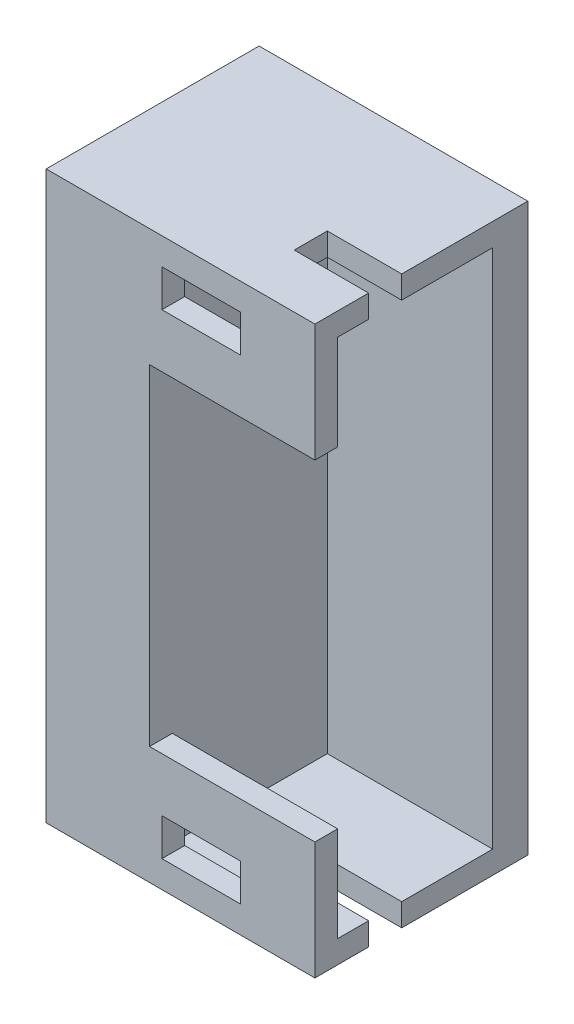
ISO-10303-21;
HEADER;
FILE_DESCRIPTION(('STEP AP214'),'2;1');
FILE_NAME('part.step','',(''),(''),'','','');
FILE_SCHEMA(('AUTOMOTIVE_DESIGN { 1 0 10303 214 1 1 1 1 }'));
ENDSEC;
DATA;
#1=APPLICATION_CONTEXT('core data for automotive mechanical design processes');
#2=APPLICATION_PROTOCOL_DEFINITION('international standard','automotive_design',2000,#1);
#3=PRODUCT_CONTEXT('',#1,'mechanical');
#4=PRODUCT('Part','Part','',(#3));
#5=PRODUCT_RELATED_PRODUCT_CATEGORY('part','',(#4));
#6=PRODUCT_DEFINITION_FORMATION('','',#4);
#7=PRODUCT_DEFINITION_CONTEXT('part definition',#1,'design');
#8=PRODUCT_DEFINITION('design','',#6,#7);
#9=PRODUCT_DEFINITION_SHAPE('','',#8);
#10=(LENGTH_UNIT() NAMED_UNIT(*) SI_UNIT(.MILLI.,.METRE.));
#11=(NAMED_UNIT(*) PLANE_ANGLE_UNIT() SI_UNIT($,.RADIAN.));
#12=(NAMED_UNIT(*) SI_UNIT($,.STERADIAN.) SOLID_ANGLE_UNIT());
#13=UNCERTAINTY_MEASURE_WITH_UNIT(LENGTH_MEASURE(1.E-05),#10,'distance_accuracy_value','');
#14=(GEOMETRIC_REPRESENTATION_CONTEXT(3) GLOBAL_UNCERTAINTY_ASSIGNED_CONTEXT((#13)) GLOBAL_UNIT_ASSIGNED_CONTEXT((#10,
#11,#12)) REPRESENTATION_CONTEXT('',''));
#15=CARTESIAN_POINT('',(0.,0.,0.));
#16=DIRECTION('',(0.,0.,1.));
#17=DIRECTION('',(1.,0.,0.));
#18=AXIS2_PLACEMENT_3D('',#15,#16,#17);
#19=CARTESIAN_POINT('',(26.,-4.,-31.));
#20=DIRECTION('',(0.,0.,1.));
#21=DIRECTION('',(1.,0.,0.));
#22=AXIS2_PLACEMENT_3D('',#19,#20,#21);
#23=PLANE('',#22);
#24=DIRECTION('',(1.,0.,0.));
#25=VECTOR('',#24,1.);
#26=CARTESIAN_POINT('',(24.2,-6.2,-31.));
#27=LINE('',#26,#25);
#28=CARTESIAN_POINT('',(24.2,-6.2,-31.));
#29=VERTEX_POINT('',#28);
#30=CARTESIAN_POINT('',(22.3,-6.2,-31.));
#31=VERTEX_POINT('',#30);
#32=EDGE_CURVE('E351',#29,#31,#27,.F.);
#33=ORIENTED_EDGE('',*,*,#32,.F.);
#34=DIRECTION('',(0.,1.,0.));
#35=VECTOR('',#34,1.);
#36=CARTESIAN_POINT('',(24.2,-5.3,-31.));
#37=LINE('',#36,#35);
#38=CARTESIAN_POINT('',(24.2,-5.3,-31.));
#39=VERTEX_POINT('',#38);
#40=EDGE_CURVE('E356',#39,#29,#37,.F.);
#41=ORIENTED_EDGE('',*,*,#40,.F.);
#42=DIRECTION('',(1.,0.,0.));
#43=VECTOR('',#42,1.);
#44=CARTESIAN_POINT('',(22.3,-5.3,-31.));
#45=LINE('',#44,#43);
#46=CARTESIAN_POINT('',(22.3,-5.3,-31.));
#47=VERTEX_POINT('',#46);
#48=EDGE_CURVE('E361',#47,#39,#45,.T.);
#49=ORIENTED_EDGE('',*,*,#48,.F.);
#50=DIRECTION('',(0.,1.,0.));
#51=VECTOR('',#50,1.);
#52=CARTESIAN_POINT('',(22.3,-6.2,-31.));
#53=LINE('',#52,#51);
#54=EDGE_CURVE('E250',#31,#47,#53,.T.);
#55=ORIENTED_EDGE('',*,*,#54,.F.);
#56=EDGE_LOOP('',(#33,#41,#49,#55));
#57=FACE_BOUND('',#56,.T.);
#58=DIRECTION('',(0.,1.,0.));
#59=VECTOR('',#58,1.);
#60=CARTESIAN_POINT('',(26.,-6.85,-31.));
#61=LINE('',#60,#59);
#62=CARTESIAN_POINT('',(26.,-4.,-31.));
#63=VERTEX_POINT('',#62);
#64=CARTESIAN_POINT('',(26.,-6.3,-31.));
#65=VERTEX_POINT('',#64);
#66=EDGE_CURVE('E206',#63,#65,#61,.F.);
#67=ORIENTED_EDGE('',*,*,#66,.T.);
#68=DIRECTION('',(1.,0.,0.));
#69=VECTOR('',#68,1.);
#70=CARTESIAN_POINT('',(26.,-6.3,-31.));
#71=LINE('',#70,#69);
#72=CARTESIAN_POINT('',(22.,-6.3,-31.));
#73=VERTEX_POINT('',#72);
#74=EDGE_CURVE('E319',#65,#73,#71,.F.);
#75=ORIENTED_EDGE('',*,*,#74,.T.);
#76=DIRECTION('',(0.,1.,0.));
#77=VECTOR('',#76,1.);
#78=CARTESIAN_POINT('',(22.,0.,-31.));
#79=LINE('',#78,#77);
#80=CARTESIAN_POINT('',(22.,-4.,-31.));
#81=VERTEX_POINT('',#80);
#82=EDGE_CURVE('E222',#81,#73,#79,.F.);
#83=ORIENTED_EDGE('',*,*,#82,.F.);
#84=DIRECTION('',(1.,0.,0.));
#85=VECTOR('',#84,1.);
#86=CARTESIAN_POINT('',(26.,-4.,-31.));
#87=LINE('',#86,#85);
#88=EDGE_CURVE('E199',#81,#63,#87,.T.);
#89=ORIENTED_EDGE('',*,*,#88,.T.);
#90=EDGE_LOOP('',(#67,#75,#83,#89));
#91=FACE_BOUND('',#90,.T.);
#92=ADVANCED_FACE('F16',(#57,#91),#23,.F.);
#93=CARTESIAN_POINT('',(26.,6.3,-31.));
#94=DIRECTION('',(0.,0.,1.));
#95=DIRECTION('',(1.,0.,0.));
#96=AXIS2_PLACEMENT_3D('',#93,#94,#95);
#97=PLANE('',#96);
#98=DIRECTION('',(1.,0.,0.));
#99=VECTOR('',#98,1.);
#100=CARTESIAN_POINT('',(24.2,5.3,-31.));
#101=LINE('',#100,#99);
#102=CARTESIAN_POINT('',(24.2,5.3,-31.));
#103=VERTEX_POINT('',#102);
#104=CARTESIAN_POINT('',(22.3,5.3,-31.));
#105=VERTEX_POINT('',#104);
#106=EDGE_CURVE('E332',#103,#105,#101,.F.);
#107=ORIENTED_EDGE('',*,*,#106,.F.);
#108=DIRECTION('',(0.,1.,0.));
#109=VECTOR('',#108,1.);
#110=CARTESIAN_POINT('',(24.2,6.2,-31.));
#111=LINE('',#110,#109);
#112=CARTESIAN_POINT('',(24.2,6.2,-31.));
#113=VERTEX_POINT('',#112);
#114=EDGE_CURVE('E337',#113,#103,#111,.F.);
#115=ORIENTED_EDGE('',*,*,#114,.F.);
#116=DIRECTION('',(1.,0.,0.));
#117=VECTOR('',#116,1.);
#118=CARTESIAN_POINT('',(22.3,6.2,-31.));
#119=LINE('',#118,#117);
#120=CARTESIAN_POINT('',(22.3,6.2,-31.));
#121=VERTEX_POINT('',#120);
#122=EDGE_CURVE('E342',#121,#113,#119,.T.);
#123=ORIENTED_EDGE('',*,*,#122,.F.);
#124=DIRECTION('',(0.,1.,0.));
#125=VECTOR('',#124,1.);
#126=CARTESIAN_POINT('',(22.3,5.3,-31.));
#127=LINE('',#126,#125);
#128=EDGE_CURVE('E347',#105,#121,#127,.T.);
#129=ORIENTED_EDGE('',*,*,#128,.F.);
#130=EDGE_LOOP('',(#107,#115,#123,#129));
#131=FACE_BOUND('',#130,.T.);
#132=DIRECTION('',(0.,1.,0.));
#133=VECTOR('',#132,1.);
#134=CARTESIAN_POINT('',(26.,-6.85,-31.));
#135=LINE('',#134,#133);
#136=CARTESIAN_POINT('',(26.,6.3,-31.));
#137=VERTEX_POINT('',#136);
#138=CARTESIAN_POINT('',(26.,4.,-31.));
#139=VERTEX_POINT('',#138);
#140=EDGE_CURVE('E19',#137,#139,#135,.F.);
#141=ORIENTED_EDGE('',*,*,#140,.T.);
#142=DIRECTION('',(1.,0.,0.));
#143=VECTOR('',#142,1.);
#144=CARTESIAN_POINT('',(26.,4.,-31.));
#145=LINE('',#144,#143);
#146=CARTESIAN_POINT('',(22.,4.,-31.));
#147=VERTEX_POINT('',#146);
#148=EDGE_CURVE('E235',#139,#147,#145,.F.);
#149=ORIENTED_EDGE('',*,*,#148,.T.);
#150=DIRECTION('',(0.,1.,0.));
#151=VECTOR('',#150,1.);
#152=CARTESIAN_POINT('',(22.,0.,-31.));
#153=LINE('',#152,#151);
#154=CARTESIAN_POINT('',(22.,6.3,-31.));
#155=VERTEX_POINT('',#154);
#156=EDGE_CURVE('E257',#155,#147,#153,.F.);
#157=ORIENTED_EDGE('',*,*,#156,.F.);
#158=DIRECTION('',(1.,0.,0.));
#159=VECTOR('',#158,1.);
#160=CARTESIAN_POINT('',(26.,6.3,-31.));
#161=LINE('',#160,#159);
#162=EDGE_CURVE('E237',#155,#137,#161,.T.);
#163=ORIENTED_EDGE('',*,*,#162,.T.);
#164=EDGE_LOOP('',(#141,#149,#157,#163));
#165=FACE_BOUND('',#164,.T.);
#166=ADVANCED_FACE('F234',(#131,#165),#97,.F.);
#167=CARTESIAN_POINT('',(26.,-6.85,-35.05));
#168=DIRECTION('',(-1.,0.,0.));
#169=DIRECTION('',(0.,0.,1.));
#170=AXIS2_PLACEMENT_3D('',#167,#168,#169);
#171=PLANE('',#170);
#172=DIRECTION('',(0.,1.,0.));
#173=VECTOR('',#172,1.);
#174=CARTESIAN_POINT('',(26.,0.,-30.45));
#175=LINE('',#174,#173);
#176=CARTESIAN_POINT('',(26.,4.,-30.45));
#177=VERTEX_POINT('',#176);
#178=CARTESIAN_POINT('',(26.,6.85,-30.45));
#179=VERTEX_POINT('',#178);
#180=EDGE_CURVE('E255',#177,#179,#175,.T.);
#181=ORIENTED_EDGE('',*,*,#180,.F.);
#182=DIRECTION('',(0.,0.,1.));
#183=VECTOR('',#182,1.);
#184=CARTESIAN_POINT('',(26.,4.,-31.));
#185=LINE('',#184,#183);
#186=EDGE_CURVE('E246',#177,#139,#185,.F.);
#187=ORIENTED_EDGE('',*,*,#186,.T.);
#188=ORIENTED_EDGE('',*,*,#140,.F.);
#189=DIRECTION('',(0.,0.,1.));
#190=VECTOR('',#189,1.);
#191=CARTESIAN_POINT('',(26.,6.3,-34.5));
#192=LINE('',#191,#190);
#193=CARTESIAN_POINT('',(26.,6.3,-31.75));
#194=VERTEX_POINT('',#193);
#195=EDGE_CURVE('E293',#137,#194,#192,.F.);
#196=ORIENTED_EDGE('',*,*,#195,.T.);
#197=DIRECTION('',(0.,1.,0.));
#198=VECTOR('',#197,1.);
#199=CARTESIAN_POINT('',(26.,-6.85,-31.75));
#200=LINE('',#199,#198);
#201=CARTESIAN_POINT('',(26.,6.85,-31.75));
#202=VERTEX_POINT('',#201);
#203=EDGE_CURVE('E283',#202,#194,#200,.F.);
#204=ORIENTED_EDGE('',*,*,#203,.F.);
#205=DIRECTION('',(0.,0.,1.));
#206=VECTOR('',#205,1.);
#207=CARTESIAN_POINT('',(26.,6.85,-35.05));
#208=LINE('',#207,#206);
#209=EDGE_CURVE('E226',#179,#202,#208,.F.);
#210=ORIENTED_EDGE('',*,*,#209,.F.);
#211=EDGE_LOOP('',(#181,#187,#188,#196,#204,#210));
#212=FACE_BOUND('',#211,.T.);
#213=ADVANCED_FACE('F253',(#212),#171,.F.);
#214=CARTESIAN_POINT('',(26.,-6.85,-35.05));
#215=DIRECTION('',(-1.,0.,0.));
#216=DIRECTION('',(0.,0.,1.));
#217=AXIS2_PLACEMENT_3D('',#214,#215,#216);
#218=PLANE('',#217);
#219=DIRECTION('',(0.,0.,-1.));
#220=VECTOR('',#219,1.);
#221=CARTESIAN_POINT('',(26.,-6.3,-31.));
#222=LINE('',#221,#220);
#223=CARTESIAN_POINT('',(26.,-6.3,-31.75));
#224=VERTEX_POINT('',#223);
#225=EDGE_CURVE('E212',#224,#65,#222,.F.);
#226=ORIENTED_EDGE('',*,*,#225,.T.);
#227=ORIENTED_EDGE('',*,*,#66,.F.);
#228=DIRECTION('',(0.,0.,-1.));
#229=VECTOR('',#228,1.);
#230=CARTESIAN_POINT('',(26.,-4.,-30.45));
#231=LINE('',#230,#229);
#232=CARTESIAN_POINT('',(26.,-4.,-30.45));
#233=VERTEX_POINT('',#232);
#234=EDGE_CURVE('E209',#63,#233,#231,.F.);
#235=ORIENTED_EDGE('',*,*,#234,.T.);
#236=DIRECTION('',(0.,1.,0.));
#237=VECTOR('',#236,1.);
#238=CARTESIAN_POINT('',(26.,0.,-30.45));
#239=LINE('',#238,#237);
#240=CARTESIAN_POINT('',(26.,-6.85,-30.45));
#241=VERTEX_POINT('',#240);
#242=EDGE_CURVE('E273',#241,#233,#239,.T.);
#243=ORIENTED_EDGE('',*,*,#242,.F.);
#244=DIRECTION('',(0.,0.,1.));
#245=VECTOR('',#244,1.);
#246=CARTESIAN_POINT('',(26.,-6.85,-35.05));
#247=LINE('',#246,#245);
#248=CARTESIAN_POINT('',(26.,-6.85,-31.75));
#249=VERTEX_POINT('',#248);
#250=EDGE_CURVE('E215',#249,#241,#247,.T.);
#251=ORIENTED_EDGE('',*,*,#250,.F.);
#252=DIRECTION('',(0.,1.,0.));
#253=VECTOR('',#252,1.);
#254=CARTESIAN_POINT('',(26.,-6.85,-31.75));
#255=LINE('',#254,#253);
#256=EDGE_CURVE('E327',#224,#249,#255,.F.);
#257=ORIENTED_EDGE('',*,*,#256,.F.);
#258=EDGE_LOOP('',(#226,#227,#235,#243,#251,#257));
#259=FACE_BOUND('',#258,.T.);
#260=ADVANCED_FACE('F207',(#259),#218,.F.);
#261=CARTESIAN_POINT('',(26.,-4.,-30.45));
#262=DIRECTION('',(0.,-1.,0.));
#263=DIRECTION('',(0.,0.,-1.));
#264=AXIS2_PLACEMENT_3D('',#261,#262,#263);
#265=PLANE('',#264);
#266=ORIENTED_EDGE('',*,*,#234,.F.);
#267=ORIENTED_EDGE('',*,*,#88,.F.);
#268=DIRECTION('',(0.,0.,-1.));
#269=VECTOR('',#268,1.);
#270=CARTESIAN_POINT('',(22.,-4.,-32.55097597597));
#271=LINE('',#270,#269);
#272=CARTESIAN_POINT('',(22.,-4.,-30.45));
#273=VERTEX_POINT('',#272);
#274=EDGE_CURVE('E219',#273,#81,#271,.T.);
#275=ORIENTED_EDGE('',*,*,#274,.F.);
#276=DIRECTION('',(1.,0.,0.));
#277=VECTOR('',#276,1.);
#278=CARTESIAN_POINT('',(23.25,-4.,-30.45));
#279=LINE('',#278,#277);
#280=EDGE_CURVE('E218',#233,#273,#279,.F.);
#281=ORIENTED_EDGE('',*,*,#280,.F.);
#282=EDGE_LOOP('',(#266,#267,#275,#281));
#283=FACE_BOUND('',#282,.T.);
#284=ADVANCED_FACE('F217',(#283),#265,.F.);
#285=CARTESIAN_POINT('',(22.,0.,-32.55097597597));
#286=DIRECTION('',(1.,0.,0.));
#287=DIRECTION('',(0.,0.,-1.));
#288=AXIS2_PLACEMENT_3D('',#285,#286,#287);
#289=PLANE('',#288);
#290=DIRECTION('',(0.,0.,1.));
#291=VECTOR('',#290,1.);
#292=CARTESIAN_POINT('',(22.,4.,-31.));
#293=LINE('',#292,#291);
#294=CARTESIAN_POINT('',(22.,4.,-30.45));
#295=VERTEX_POINT('',#294);
#296=EDGE_CURVE('E249',#147,#295,#293,.T.);
#297=ORIENTED_EDGE('',*,*,#296,.T.);
#298=DIRECTION('',(0.,1.,0.));
#299=VECTOR('',#298,1.);
#300=CARTESIAN_POINT('',(22.,0.,-30.45));
#301=LINE('',#300,#299);
#302=EDGE_CURVE('E267',#273,#295,#301,.T.);
#303=ORIENTED_EDGE('',*,*,#302,.F.);
#304=ORIENTED_EDGE('',*,*,#274,.T.);
#305=ORIENTED_EDGE('',*,*,#82,.T.);
#306=DIRECTION('',(0.,0.,-1.));
#307=VECTOR('',#306,1.);
#308=CARTESIAN_POINT('',(22.,-6.3,-31.));
#309=LINE('',#308,#307);
#310=CARTESIAN_POINT('',(22.,-6.3,-34.75));
#311=VERTEX_POINT('',#310);
#312=EDGE_CURVE('E317',#73,#311,#309,.T.);
#313=ORIENTED_EDGE('',*,*,#312,.T.);
#314=DIRECTION('',(0.,1.,0.));
#315=VECTOR('',#314,1.);
#316=CARTESIAN_POINT('',(22.,-6.3,-34.75));
#317=LINE('',#316,#315);
#318=CARTESIAN_POINT('',(22.,6.3,-34.75));
#319=VERTEX_POINT('',#318);
#320=EDGE_CURVE('E305',#311,#319,#317,.T.);
#321=ORIENTED_EDGE('',*,*,#320,.T.);
#322=DIRECTION('',(0.,0.,1.));
#323=VECTOR('',#322,1.);
#324=CARTESIAN_POINT('',(22.,6.3,-34.5));
#325=LINE('',#324,#323);
#326=EDGE_CURVE('E296',#319,#155,#325,.T.);
#327=ORIENTED_EDGE('',*,*,#326,.T.);
#328=ORIENTED_EDGE('',*,*,#156,.T.);
#329=EDGE_LOOP('',(#297,#303,#304,#305,#313,#321,#327,#328));
#330=FACE_BOUND('',#329,.T.);
#331=ADVANCED_FACE('F264',(#330),#289,.T.);
#332=CARTESIAN_POINT('',(26.,4.,-31.));
#333=DIRECTION('',(0.,1.,0.));
#334=DIRECTION('',(0.,0.,1.));
#335=AXIS2_PLACEMENT_3D('',#332,#333,#334);
#336=PLANE('',#335);
#337=ORIENTED_EDGE('',*,*,#186,.F.);
#338=DIRECTION('',(1.,0.,0.));
#339=VECTOR('',#338,1.);
#340=CARTESIAN_POINT('',(23.25,4.,-30.45));
#341=LINE('',#340,#339);
#342=EDGE_CURVE('E269',#295,#177,#341,.T.);
#343=ORIENTED_EDGE('',*,*,#342,.F.);
#344=ORIENTED_EDGE('',*,*,#296,.F.);
#345=ORIENTED_EDGE('',*,*,#148,.F.);
#346=EDGE_LOOP('',(#337,#343,#344,#345));
#347=FACE_BOUND('',#346,.T.);
#348=ADVANCED_FACE('F244',(#347),#336,.F.);
#349=CARTESIAN_POINT('',(22.3,-6.2,-30.45));
#350=DIRECTION('',(1.,0.,0.));
#351=DIRECTION('',(0.,0.,-1.));
#352=AXIS2_PLACEMENT_3D('',#349,#350,#351);
#353=PLANE('',#352);
#354=ORIENTED_EDGE('',*,*,#54,.T.);
#355=DIRECTION('',(0.,0.,-1.));
#356=VECTOR('',#355,1.);
#357=CARTESIAN_POINT('',(22.3,-5.3,-30.45));
#358=LINE('',#357,#356);
#359=CARTESIAN_POINT('',(22.3,-5.3,-30.45));
#360=VERTEX_POINT('',#359);
#361=EDGE_CURVE('E363',#360,#47,#358,.T.);
#362=ORIENTED_EDGE('',*,*,#361,.F.);
#363=DIRECTION('',(0.,1.,0.));
#364=VECTOR('',#363,1.);
#365=CARTESIAN_POINT('',(22.3,0.,-30.45));
#366=LINE('',#365,#364);
#367=CARTESIAN_POINT('',(22.3,-6.2,-30.45));
#368=VERTEX_POINT('',#367);
#369=EDGE_CURVE('E271',#368,#360,#366,.T.);
#370=ORIENTED_EDGE('',*,*,#369,.F.);
#371=DIRECTION('',(0.,0.,1.));
#372=VECTOR('',#371,1.);
#373=CARTESIAN_POINT('',(22.3,-6.2,-30.45));
#374=LINE('',#373,#372);
#375=EDGE_CURVE('E349',#31,#368,#374,.T.);
#376=ORIENTED_EDGE('',*,*,#375,.F.);
#377=EDGE_LOOP('',(#354,#362,#370,#376));
#378=FACE_BOUND('',#377,.T.);
#379=ADVANCED_FACE('F369',(#378),#353,.T.);
#380=CARTESIAN_POINT('',(22.3,-5.3,-30.45));
#381=DIRECTION('',(0.,-1.,0.));
#382=DIRECTION('',(0.,0.,-1.));
#383=AXIS2_PLACEMENT_3D('',#380,#381,#382);
#384=PLANE('',#383);
#385=ORIENTED_EDGE('',*,*,#48,.T.);
#386=DIRECTION('',(0.,0.,1.));
#387=VECTOR('',#386,1.);
#388=CARTESIAN_POINT('',(24.2,-5.3,-30.45));
#389=LINE('',#388,#387);
#390=CARTESIAN_POINT('',(24.2,-5.3,-30.45));
#391=VERTEX_POINT('',#390);
#392=EDGE_CURVE('E358',#391,#39,#389,.F.);
#393=ORIENTED_EDGE('',*,*,#392,.F.);
#394=DIRECTION('',(1.,0.,0.));
#395=VECTOR('',#394,1.);
#396=CARTESIAN_POINT('',(23.25,-5.3,-30.45));
#397=LINE('',#396,#395);
#398=EDGE_CURVE('E378',#360,#391,#397,.T.);
#399=ORIENTED_EDGE('',*,*,#398,.F.);
#400=ORIENTED_EDGE('',*,*,#361,.T.);
#401=EDGE_LOOP('',(#385,#393,#399,#400));
#402=FACE_BOUND('',#401,.T.);
#403=ADVANCED_FACE('F376',(#402),#384,.T.);
#404=CARTESIAN_POINT('',(24.2,-5.3,-30.45));
#405=DIRECTION('',(-1.,0.,0.));
#406=DIRECTION('',(0.,0.,1.));
#407=AXIS2_PLACEMENT_3D('',#404,#405,#406);
#408=PLANE('',#407);
#409=ORIENTED_EDGE('',*,*,#40,.T.);
#410=DIRECTION('',(0.,0.,1.));
#411=VECTOR('',#410,1.);
#412=CARTESIAN_POINT('',(24.2,-6.2,-30.45));
#413=LINE('',#412,#411);
#414=CARTESIAN_POINT('',(24.2,-6.2,-30.45));
#415=VERTEX_POINT('',#414);
#416=EDGE_CURVE('E353',#415,#29,#413,.F.);
#417=ORIENTED_EDGE('',*,*,#416,.F.);
#418=DIRECTION('',(0.,1.,0.));
#419=VECTOR('',#418,1.);
#420=CARTESIAN_POINT('',(24.2,0.,-30.45));
#421=LINE('',#420,#419);
#422=EDGE_CURVE('E391',#391,#415,#421,.F.);
#423=ORIENTED_EDGE('',*,*,#422,.F.);
#424=ORIENTED_EDGE('',*,*,#392,.T.);
#425=EDGE_LOOP('',(#409,#417,#423,#424));
#426=FACE_BOUND('',#425,.T.);
#427=ADVANCED_FACE('F382',(#426),#408,.T.);
#428=CARTESIAN_POINT('',(24.2,-6.2,-30.45));
#429=DIRECTION('',(0.,1.,0.));
#430=DIRECTION('',(0.,0.,1.));
#431=AXIS2_PLACEMENT_3D('',#428,#429,#430);
#432=PLANE('',#431);
#433=ORIENTED_EDGE('',*,*,#32,.T.);
#434=ORIENTED_EDGE('',*,*,#375,.T.);
#435=DIRECTION('',(1.,0.,0.));
#436=VECTOR('',#435,1.);
#437=CARTESIAN_POINT('',(23.25,-6.2,-30.45));
#438=LINE('',#437,#436);
#439=EDGE_CURVE('E388',#415,#368,#438,.F.);
#440=ORIENTED_EDGE('',*,*,#439,.F.);
#441=ORIENTED_EDGE('',*,*,#416,.T.);
#442=EDGE_LOOP('',(#433,#434,#440,#441));
#443=FACE_BOUND('',#442,.T.);
#444=ADVANCED_FACE('F386',(#443),#432,.T.);
#445=CARTESIAN_POINT('',(22.3,5.3,-30.45));
#446=DIRECTION('',(1.,0.,0.));
#447=DIRECTION('',(0.,0.,-1.));
#448=AXIS2_PLACEMENT_3D('',#445,#446,#447);
#449=PLANE('',#448);
#450=ORIENTED_EDGE('',*,*,#128,.T.);
#451=DIRECTION('',(0.,0.,-1.));
#452=VECTOR('',#451,1.);
#453=CARTESIAN_POINT('',(22.3,6.2,-30.45));
#454=LINE('',#453,#452);
#455=CARTESIAN_POINT('',(22.3,6.2,-30.45));
#456=VERTEX_POINT('',#455);
#457=EDGE_CURVE('E344',#456,#121,#454,.T.);
#458=ORIENTED_EDGE('',*,*,#457,.F.);
#459=DIRECTION('',(0.,1.,0.));
#460=VECTOR('',#459,1.);
#461=CARTESIAN_POINT('',(22.3,0.,-30.45));
#462=LINE('',#461,#460);
#463=CARTESIAN_POINT('',(22.3,5.3,-30.45));
#464=VERTEX_POINT('',#463);
#465=EDGE_CURVE('E390',#464,#456,#462,.T.);
#466=ORIENTED_EDGE('',*,*,#465,.F.);
#467=DIRECTION('',(0.,0.,1.));
#468=VECTOR('',#467,1.);
#469=CARTESIAN_POINT('',(22.3,5.3,-30.45));
#470=LINE('',#469,#468);
#471=EDGE_CURVE('E330',#105,#464,#470,.T.);
#472=ORIENTED_EDGE('',*,*,#471,.F.);
#473=EDGE_LOOP('',(#450,#458,#466,#472));
#474=FACE_BOUND('',#473,.T.);
#475=ADVANCED_FACE('F488',(#474),#449,.T.);
#476=CARTESIAN_POINT('',(22.3,6.2,-30.45));
#477=DIRECTION('',(0.,-1.,0.));
#478=DIRECTION('',(0.,0.,-1.));
#479=AXIS2_PLACEMENT_3D('',#476,#477,#478);
#480=PLANE('',#479);
#481=ORIENTED_EDGE('',*,*,#122,.T.);
#482=DIRECTION('',(0.,0.,1.));
#483=VECTOR('',#482,1.);
#484=CARTESIAN_POINT('',(24.2,6.2,-30.45));
#485=LINE('',#484,#483);
#486=CARTESIAN_POINT('',(24.2,6.2,-30.45));
#487=VERTEX_POINT('',#486);
#488=EDGE_CURVE('E339',#487,#113,#485,.F.);
#489=ORIENTED_EDGE('',*,*,#488,.F.);
#490=DIRECTION('',(1.,0.,0.));
#491=VECTOR('',#490,1.);
#492=CARTESIAN_POINT('',(23.25,6.2,-30.45));
#493=LINE('',#492,#491);
#494=EDGE_CURVE('E393',#456,#487,#493,.T.);
#495=ORIENTED_EDGE('',*,*,#494,.F.);
#496=ORIENTED_EDGE('',*,*,#457,.T.);
#497=EDGE_LOOP('',(#481,#489,#495,#496));
#498=FACE_BOUND('',#497,.T.);
#499=ADVANCED_FACE('F477',(#498),#480,.T.);
#500=CARTESIAN_POINT('',(24.2,6.2,-30.45));
#501=DIRECTION('',(-1.,0.,0.));
#502=DIRECTION('',(0.,0.,1.));
#503=AXIS2_PLACEMENT_3D('',#500,#501,#502);
#504=PLANE('',#503);
#505=ORIENTED_EDGE('',*,*,#114,.T.);
#506=DIRECTION('',(0.,0.,1.));
#507=VECTOR('',#506,1.);
#508=CARTESIAN_POINT('',(24.2,5.3,-30.45));
#509=LINE('',#508,#507);
#510=CARTESIAN_POINT('',(24.2,5.3,-30.45));
#511=VERTEX_POINT('',#510);
#512=EDGE_CURVE('E334',#511,#103,#509,.F.);
#513=ORIENTED_EDGE('',*,*,#512,.F.);
#514=DIRECTION('',(0.,1.,0.));
#515=VECTOR('',#514,1.);
#516=CARTESIAN_POINT('',(24.2,0.,-30.45));
#517=LINE('',#516,#515);
#518=EDGE_CURVE('E469',#487,#511,#517,.F.);
#519=ORIENTED_EDGE('',*,*,#518,.F.);
#520=ORIENTED_EDGE('',*,*,#488,.T.);
#521=EDGE_LOOP('',(#505,#513,#519,#520));
#522=FACE_BOUND('',#521,.T.);
#523=ADVANCED_FACE('F481',(#522),#504,.T.);
#524=CARTESIAN_POINT('',(24.2,5.3,-30.45));
#525=DIRECTION('',(0.,1.,0.));
#526=DIRECTION('',(0.,0.,1.));
#527=AXIS2_PLACEMENT_3D('',#524,#525,#526);
#528=PLANE('',#527);
#529=ORIENTED_EDGE('',*,*,#106,.T.);
#530=ORIENTED_EDGE('',*,*,#471,.T.);
#531=DIRECTION('',(1.,0.,0.));
#532=VECTOR('',#531,1.);
#533=CARTESIAN_POINT('',(23.25,5.3,-30.45));
#534=LINE('',#533,#532);
#535=EDGE_CURVE('E466',#511,#464,#534,.F.);
#536=ORIENTED_EDGE('',*,*,#535,.F.);
#537=ORIENTED_EDGE('',*,*,#512,.T.);
#538=EDGE_LOOP('',(#529,#530,#536,#537));
#539=FACE_BOUND('',#538,.T.);
#540=ADVANCED_FACE('F485',(#539),#528,.T.);
#541=CARTESIAN_POINT('',(26.,-6.85,-31.75));
#542=DIRECTION('',(0.,0.,-1.));
#543=DIRECTION('',(-1.,0.,0.));
#544=AXIS2_PLACEMENT_3D('',#541,#542,#543);
#545=PLANE('',#544);
#546=DIRECTION('',(0.,1.,0.));
#547=VECTOR('',#546,1.);
#548=CARTESIAN_POINT('',(24.2,0.,-31.75));
#549=LINE('',#548,#547);
#550=CARTESIAN_POINT('',(24.2,-6.85,-31.75));
#551=VERTEX_POINT('',#550);
#552=CARTESIAN_POINT('',(24.2,-6.3,-31.75));
#553=VERTEX_POINT('',#552);
#554=EDGE_CURVE('E325',#551,#553,#549,.T.);
#555=ORIENTED_EDGE('',*,*,#554,.T.);
#556=DIRECTION('',(1.,0.,0.));
#557=VECTOR('',#556,1.);
#558=CARTESIAN_POINT('',(26.,-6.3,-31.75));
#559=LINE('',#558,#557);
#560=EDGE_CURVE('E308',#553,#224,#559,.T.);
#561=ORIENTED_EDGE('',*,*,#560,.T.);
#562=ORIENTED_EDGE('',*,*,#256,.T.);
#563=DIRECTION('',(1.,0.,0.));
#564=VECTOR('',#563,1.);
#565=CARTESIAN_POINT('',(20.5,-6.85,-31.75));
#566=LINE('',#565,#564);
#567=EDGE_CURVE('E455',#249,#551,#566,.F.);
#568=ORIENTED_EDGE('',*,*,#567,.T.);
#569=EDGE_LOOP('',(#555,#561,#562,#568));
#570=FACE_BOUND('',#569,.T.);
#571=ADVANCED_FACE('F522',(#570),#545,.T.);
#572=CARTESIAN_POINT('',(24.2,0.,-32.15));
#573=DIRECTION('',(-1.,0.,0.));
#574=DIRECTION('',(0.,0.,1.));
#575=AXIS2_PLACEMENT_3D('',#572,#573,#574);
#576=PLANE('',#575);
#577=DIRECTION('',(0.,1.,0.));
#578=VECTOR('',#577,1.);
#579=CARTESIAN_POINT('',(24.2,6.85,-32.55));
#580=LINE('',#579,#578);
#581=CARTESIAN_POINT('',(24.2,-6.3,-32.55));
#582=VERTEX_POINT('',#581);
#583=CARTESIAN_POINT('',(24.2,-6.85,-32.55));
#584=VERTEX_POINT('',#583);
#585=EDGE_CURVE('E321',#582,#584,#580,.F.);
#586=ORIENTED_EDGE('',*,*,#585,.F.);
#587=DIRECTION('',(0.,0.,-1.));
#588=VECTOR('',#587,1.);
#589=CARTESIAN_POINT('',(24.2,-6.3,-31.));
#590=LINE('',#589,#588);
#591=EDGE_CURVE('E311',#582,#553,#590,.F.);
#592=ORIENTED_EDGE('',*,*,#591,.T.);
#593=ORIENTED_EDGE('',*,*,#554,.F.);
#594=DIRECTION('',(0.,0.,1.));
#595=VECTOR('',#594,1.);
#596=CARTESIAN_POINT('',(24.2,-6.85,-35.05));
#597=LINE('',#596,#595);
#598=EDGE_CURVE('E450',#551,#584,#597,.F.);
#599=ORIENTED_EDGE('',*,*,#598,.T.);
#600=EDGE_LOOP('',(#586,#592,#593,#599));
#601=FACE_BOUND('',#600,.T.);
#602=ADVANCED_FACE('F525',(#601),#576,.F.);
#603=CARTESIAN_POINT('',(26.,6.85,-32.55));
#604=DIRECTION('',(0.,0.,1.));
#605=DIRECTION('',(1.,0.,0.));
#606=AXIS2_PLACEMENT_3D('',#603,#604,#605);
#607=PLANE('',#606);
#608=ORIENTED_EDGE('',*,*,#585,.T.);
#609=DIRECTION('',(1.,0.,0.));
#610=VECTOR('',#609,1.);
#611=CARTESIAN_POINT('',(20.5,-6.85,-32.55));
#612=LINE('',#611,#610);
#613=CARTESIAN_POINT('',(26.,-6.85,-32.55));
#614=VERTEX_POINT('',#613);
#615=EDGE_CURVE('E440',#584,#614,#612,.T.);
#616=ORIENTED_EDGE('',*,*,#615,.T.);
#617=DIRECTION('',(0.,1.,0.));
#618=VECTOR('',#617,1.);
#619=CARTESIAN_POINT('',(26.,6.85,-32.55));
#620=LINE('',#619,#618);
#621=CARTESIAN_POINT('',(26.,-6.3,-32.55));
#622=VERTEX_POINT('',#621);
#623=EDGE_CURVE('E323',#614,#622,#620,.T.);
#624=ORIENTED_EDGE('',*,*,#623,.T.);
#625=DIRECTION('',(1.,0.,0.));
#626=VECTOR('',#625,1.);
#627=CARTESIAN_POINT('',(26.,-6.3,-32.55));
#628=LINE('',#627,#626);
#629=EDGE_CURVE('E314',#622,#582,#628,.F.);
#630=ORIENTED_EDGE('',*,*,#629,.T.);
#631=EDGE_LOOP('',(#608,#616,#624,#630));
#632=FACE_BOUND('',#631,.T.);
#633=ADVANCED_FACE('F529',(#632),#607,.T.);
#634=CARTESIAN_POINT('',(26.,-6.3,-31.));
#635=DIRECTION('',(0.,-1.,0.));
#636=DIRECTION('',(0.,0.,-1.));
#637=AXIS2_PLACEMENT_3D('',#634,#635,#636);
#638=PLANE('',#637);
#639=ORIENTED_EDGE('',*,*,#560,.F.);
#640=ORIENTED_EDGE('',*,*,#591,.F.);
#641=ORIENTED_EDGE('',*,*,#629,.F.);
#642=DIRECTION('',(0.,0.,1.));
#643=VECTOR('',#642,1.);
#644=CARTESIAN_POINT('',(26.,-6.3,-35.05));
#645=LINE('',#644,#643);
#646=CARTESIAN_POINT('',(26.,-6.3,-34.75));
#647=VERTEX_POINT('',#646);
#648=EDGE_CURVE('E445',#622,#647,#645,.F.);
#649=ORIENTED_EDGE('',*,*,#648,.T.);
#650=DIRECTION('',(-1.,0.,0.));
#651=VECTOR('',#650,1.);
#652=CARTESIAN_POINT('',(26.,-6.3,-34.75));
#653=LINE('',#652,#651);
#654=EDGE_CURVE('E302',#647,#311,#653,.T.);
#655=ORIENTED_EDGE('',*,*,#654,.T.);
#656=ORIENTED_EDGE('',*,*,#312,.F.);
#657=ORIENTED_EDGE('',*,*,#74,.F.);
#658=ORIENTED_EDGE('',*,*,#225,.F.);
#659=EDGE_LOOP('',(#639,#640,#641,#649,#655,#656,#657,#658));
#660=FACE_BOUND('',#659,.T.);
#661=ADVANCED_FACE('F533',(#660),#638,.F.);
#662=CARTESIAN_POINT('',(26.,-6.3,-34.75));
#663=DIRECTION('',(0.,0.,-1.));
#664=DIRECTION('',(-1.,0.,0.));
#665=AXIS2_PLACEMENT_3D('',#662,#663,#664);
#666=PLANE('',#665);
#667=DIRECTION('',(0.,1.,0.));
#668=VECTOR('',#667,1.);
#669=CARTESIAN_POINT('',(26.,-6.85,-34.75));
#670=LINE('',#669,#668);
#671=CARTESIAN_POINT('',(26.,6.3,-34.75));
#672=VERTEX_POINT('',#671);
#673=EDGE_CURVE('E448',#647,#672,#670,.T.);
#674=ORIENTED_EDGE('',*,*,#673,.T.);
#675=DIRECTION('',(1.,0.,0.));
#676=VECTOR('',#675,1.);
#677=CARTESIAN_POINT('',(26.,6.3,-34.75));
#678=LINE('',#677,#676);
#679=EDGE_CURVE('E299',#672,#319,#678,.F.);
#680=ORIENTED_EDGE('',*,*,#679,.T.);
#681=ORIENTED_EDGE('',*,*,#320,.F.);
#682=ORIENTED_EDGE('',*,*,#654,.F.);
#683=EDGE_LOOP('',(#674,#680,#681,#682));
#684=FACE_BOUND('',#683,.T.);
#685=ADVANCED_FACE('F537',(#684),#666,.F.);
#686=CARTESIAN_POINT('',(26.,6.3,-34.5));
#687=DIRECTION('',(0.,1.,0.));
#688=DIRECTION('',(0.,0.,1.));
#689=AXIS2_PLACEMENT_3D('',#686,#687,#688);
#690=PLANE('',#689);
#691=DIRECTION('',(1.,0.,0.));
#692=VECTOR('',#691,1.);
#693=CARTESIAN_POINT('',(26.,6.3,-32.55));
#694=LINE('',#693,#692);
#695=CARTESIAN_POINT('',(24.2,6.3,-32.55));
#696=VERTEX_POINT('',#695);
#697=CARTESIAN_POINT('',(26.,6.3,-32.55));
#698=VERTEX_POINT('',#697);
#699=EDGE_CURVE('E291',#696,#698,#694,.T.);
#700=ORIENTED_EDGE('',*,*,#699,.F.);
#701=DIRECTION('',(0.,0.,1.));
#702=VECTOR('',#701,1.);
#703=CARTESIAN_POINT('',(24.2,6.3,-32.15));
#704=LINE('',#703,#702);
#705=CARTESIAN_POINT('',(24.2,6.3,-31.75));
#706=VERTEX_POINT('',#705);
#707=EDGE_CURVE('E285',#696,#706,#704,.T.);
#708=ORIENTED_EDGE('',*,*,#707,.T.);
#709=DIRECTION('',(-1.,0.,0.));
#710=VECTOR('',#709,1.);
#711=CARTESIAN_POINT('',(26.,6.3,-31.75));
#712=LINE('',#711,#710);
#713=EDGE_CURVE('E281',#194,#706,#712,.T.);
#714=ORIENTED_EDGE('',*,*,#713,.F.);
#715=ORIENTED_EDGE('',*,*,#195,.F.);
#716=ORIENTED_EDGE('',*,*,#162,.F.);
#717=ORIENTED_EDGE('',*,*,#326,.F.);
#718=ORIENTED_EDGE('',*,*,#679,.F.);
#719=DIRECTION('',(0.,0.,1.));
#720=VECTOR('',#719,1.);
#721=CARTESIAN_POINT('',(26.,6.3,-35.05));
#722=LINE('',#721,#720);
#723=EDGE_CURVE('E572',#672,#698,#722,.T.);
#724=ORIENTED_EDGE('',*,*,#723,.T.);
#725=EDGE_LOOP('',(#700,#708,#714,#715,#716,#717,#718,#724));
#726=FACE_BOUND('',#725,.T.);
#727=ADVANCED_FACE('F541',(#726),#690,.F.);
#728=CARTESIAN_POINT('',(26.,6.85,-32.55));
#729=DIRECTION('',(0.,0.,1.));
#730=DIRECTION('',(1.,0.,0.));
#731=AXIS2_PLACEMENT_3D('',#728,#729,#730);
#732=PLANE('',#731);
#733=DIRECTION('',(0.,1.,0.));
#734=VECTOR('',#733,1.);
#735=CARTESIAN_POINT('',(24.2,0.,-32.55));
#736=LINE('',#735,#734);
#737=CARTESIAN_POINT('',(24.2,6.85,-32.55));
#738=VERTEX_POINT('',#737);
#739=EDGE_CURVE('E288',#738,#696,#736,.F.);
#740=ORIENTED_EDGE('',*,*,#739,.T.);
#741=ORIENTED_EDGE('',*,*,#699,.T.);
#742=DIRECTION('',(0.,1.,0.));
#743=VECTOR('',#742,1.);
#744=CARTESIAN_POINT('',(26.,-6.85,-32.55));
#745=LINE('',#744,#743);
#746=CARTESIAN_POINT('',(26.,6.85,-32.55));
#747=VERTEX_POINT('',#746);
#748=EDGE_CURVE('E566',#698,#747,#745,.T.);
#749=ORIENTED_EDGE('',*,*,#748,.T.);
#750=DIRECTION('',(1.,0.,0.));
#751=VECTOR('',#750,1.);
#752=CARTESIAN_POINT('',(26.,6.85,-32.55));
#753=LINE('',#752,#751);
#754=EDGE_CURVE('E561',#747,#738,#753,.F.);
#755=ORIENTED_EDGE('',*,*,#754,.T.);
#756=EDGE_LOOP('',(#740,#741,#749,#755));
#757=FACE_BOUND('',#756,.T.);
#758=ADVANCED_FACE('F545',(#757),#732,.T.);
#759=CARTESIAN_POINT('',(24.2,0.,-32.15));
#760=DIRECTION('',(-1.,0.,0.));
#761=DIRECTION('',(0.,0.,1.));
#762=AXIS2_PLACEMENT_3D('',#759,#760,#761);
#763=PLANE('',#762);
#764=ORIENTED_EDGE('',*,*,#739,.F.);
#765=DIRECTION('',(0.,0.,-1.));
#766=VECTOR('',#765,1.);
#767=CARTESIAN_POINT('',(24.2,6.85,-35.05));
#768=LINE('',#767,#766);
#769=CARTESIAN_POINT('',(24.2,6.85,-31.75));
#770=VERTEX_POINT('',#769);
#771=EDGE_CURVE('E558',#738,#770,#768,.F.);
#772=ORIENTED_EDGE('',*,*,#771,.T.);
#773=DIRECTION('',(0.,1.,0.));
#774=VECTOR('',#773,1.);
#775=CARTESIAN_POINT('',(24.2,-6.85,-31.75));
#776=LINE('',#775,#774);
#777=EDGE_CURVE('E279',#706,#770,#776,.T.);
#778=ORIENTED_EDGE('',*,*,#777,.F.);
#779=ORIENTED_EDGE('',*,*,#707,.F.);
#780=EDGE_LOOP('',(#764,#772,#778,#779));
#781=FACE_BOUND('',#780,.T.);
#782=ADVANCED_FACE('F412',(#781),#763,.F.);
#783=CARTESIAN_POINT('',(26.,-6.85,-31.75));
#784=DIRECTION('',(0.,0.,-1.));
#785=DIRECTION('',(-1.,0.,0.));
#786=AXIS2_PLACEMENT_3D('',#783,#784,#785);
#787=PLANE('',#786);
#788=ORIENTED_EDGE('',*,*,#777,.T.);
#789=DIRECTION('',(1.,0.,0.));
#790=VECTOR('',#789,1.);
#791=CARTESIAN_POINT('',(26.,6.85,-31.75));
#792=LINE('',#791,#790);
#793=EDGE_CURVE('E563',#770,#202,#792,.T.);
#794=ORIENTED_EDGE('',*,*,#793,.T.);
#795=ORIENTED_EDGE('',*,*,#203,.T.);
#796=ORIENTED_EDGE('',*,*,#713,.T.);
#797=EDGE_LOOP('',(#788,#794,#795,#796));
#798=FACE_BOUND('',#797,.T.);
#799=ADVANCED_FACE('F401',(#798),#787,.T.);
#800=CARTESIAN_POINT('',(23.25,0.,-30.45));
#801=DIRECTION('',(0.,0.,1.));
#802=DIRECTION('',(1.,0.,0.));
#803=AXIS2_PLACEMENT_3D('',#800,#801,#802);
#804=PLANE('',#803);
#805=ORIENTED_EDGE('',*,*,#518,.T.);
#806=ORIENTED_EDGE('',*,*,#535,.T.);
#807=ORIENTED_EDGE('',*,*,#465,.T.);
#808=ORIENTED_EDGE('',*,*,#494,.T.);
#809=EDGE_LOOP('',(#805,#806,#807,#808));
#810=FACE_BOUND('',#809,.T.);
#811=ORIENTED_EDGE('',*,*,#422,.T.);
#812=ORIENTED_EDGE('',*,*,#439,.T.);
#813=ORIENTED_EDGE('',*,*,#369,.T.);
#814=ORIENTED_EDGE('',*,*,#398,.T.);
#815=EDGE_LOOP('',(#811,#812,#813,#814));
#816=FACE_BOUND('',#815,.T.);
#817=ORIENTED_EDGE('',*,*,#302,.T.);
#818=ORIENTED_EDGE('',*,*,#342,.T.);
#819=ORIENTED_EDGE('',*,*,#180,.T.);
#820=DIRECTION('',(1.,0.,0.));
#821=VECTOR('',#820,1.);
#822=CARTESIAN_POINT('',(26.,6.85,-30.45));
#823=LINE('',#822,#821);
#824=CARTESIAN_POINT('',(19.5,6.85,-30.45));
#825=VERTEX_POINT('',#824);
#826=EDGE_CURVE('E584',#179,#825,#823,.F.);
#827=ORIENTED_EDGE('',*,*,#826,.T.);
#828=DIRECTION('',(0.,1.,0.));
#829=VECTOR('',#828,1.);
#830=CARTESIAN_POINT('',(19.5,6.85,-30.45));
#831=LINE('',#830,#829);
#832=CARTESIAN_POINT('',(19.5,-6.85,-30.45));
#833=VERTEX_POINT('',#832);
#834=EDGE_CURVE('E464',#825,#833,#831,.F.);
#835=ORIENTED_EDGE('',*,*,#834,.T.);
#836=DIRECTION('',(1.,0.,0.));
#837=VECTOR('',#836,1.);
#838=CARTESIAN_POINT('',(20.5,-6.85,-30.45));
#839=LINE('',#838,#837);
#840=EDGE_CURVE('E458',#833,#241,#839,.T.);
#841=ORIENTED_EDGE('',*,*,#840,.T.);
#842=ORIENTED_EDGE('',*,*,#242,.T.);
#843=ORIENTED_EDGE('',*,*,#280,.T.);
#844=EDGE_LOOP('',(#817,#818,#819,#827,#835,#841,#842,#843));
#845=FACE_BOUND('',#844,.T.);
#846=ADVANCED_FACE('F398',(#810,#816,#845),#804,.T.);
#847=CARTESIAN_POINT('',(19.5,6.85,-35.05));
#848=DIRECTION('',(1.,0.,0.));
#849=DIRECTION('',(0.,0.,-1.));
#850=AXIS2_PLACEMENT_3D('',#847,#848,#849);
#851=PLANE('',#850);
#852=DIRECTION('',(0.,1.,0.));
#853=VECTOR('',#852,1.);
#854=CARTESIAN_POINT('',(19.5,0.,-35.6));
#855=LINE('',#854,#853);
#856=CARTESIAN_POINT('',(19.5,6.85,-35.6));
#857=VERTEX_POINT('',#856);
#858=CARTESIAN_POINT('',(19.5,-6.85,-35.6));
#859=VERTEX_POINT('',#858);
#860=EDGE_CURVE('E591',#857,#859,#855,.F.);
#861=ORIENTED_EDGE('',*,*,#860,.T.);
#862=DIRECTION('',(0.,0.,1.));
#863=VECTOR('',#862,1.);
#864=CARTESIAN_POINT('',(19.5,-6.85,-35.05));
#865=LINE('',#864,#863);
#866=EDGE_CURVE('E461',#859,#833,#865,.T.);
#867=ORIENTED_EDGE('',*,*,#866,.T.);
#868=ORIENTED_EDGE('',*,*,#834,.F.);
#869=DIRECTION('',(0.,0.,-1.));
#870=VECTOR('',#869,1.);
#871=CARTESIAN_POINT('',(19.5,6.85,-35.05));
#872=LINE('',#871,#870);
#873=EDGE_CURVE('E586',#825,#857,#872,.T.);
#874=ORIENTED_EDGE('',*,*,#873,.T.);
#875=EDGE_LOOP('',(#861,#867,#868,#874));
#876=FACE_BOUND('',#875,.T.);
#877=ADVANCED_FACE('F400',(#876),#851,.F.);
#878=CARTESIAN_POINT('',(20.5,-6.85,-35.05));
#879=DIRECTION('',(0.,1.,0.));
#880=DIRECTION('',(0.,0.,1.));
#881=AXIS2_PLACEMENT_3D('',#878,#879,#880);
#882=PLANE('',#881);
#883=DIRECTION('',(0.,0.,1.));
#884=VECTOR('',#883,1.);
#885=CARTESIAN_POINT('',(26.,-6.85,-35.05));
#886=LINE('',#885,#884);
#887=CARTESIAN_POINT('',(26.,-6.85,-35.6));
#888=VERTEX_POINT('',#887);
#889=EDGE_CURVE('E437',#888,#614,#886,.T.);
#890=ORIENTED_EDGE('',*,*,#889,.T.);
#891=ORIENTED_EDGE('',*,*,#615,.F.);
#892=ORIENTED_EDGE('',*,*,#598,.F.);
#893=ORIENTED_EDGE('',*,*,#567,.F.);
#894=ORIENTED_EDGE('',*,*,#250,.T.);
#895=ORIENTED_EDGE('',*,*,#840,.F.);
#896=ORIENTED_EDGE('',*,*,#866,.F.);
#897=DIRECTION('',(1.,0.,0.));
#898=VECTOR('',#897,1.);
#899=CARTESIAN_POINT('',(23.25,-6.85,-35.6));
#900=LINE('',#899,#898);
#901=EDGE_CURVE('E443',#859,#888,#900,.T.);
#902=ORIENTED_EDGE('',*,*,#901,.T.);
#903=EDGE_LOOP('',(#890,#891,#892,#893,#894,#895,#896,#902));
#904=FACE_BOUND('',#903,.T.);
#905=ADVANCED_FACE('F409',(#904),#882,.F.);
#906=CARTESIAN_POINT('',(26.,-6.85,-35.05));
#907=DIRECTION('',(-1.,0.,0.));
#908=DIRECTION('',(0.,0.,1.));
#909=AXIS2_PLACEMENT_3D('',#906,#907,#908);
#910=PLANE('',#909);
#911=DIRECTION('',(0.,0.,-1.));
#912=VECTOR('',#911,1.);
#913=CARTESIAN_POINT('',(26.,6.85,-35.05));
#914=LINE('',#913,#912);
#915=CARTESIAN_POINT('',(26.,6.85,-35.6));
#916=VERTEX_POINT('',#915);
#917=EDGE_CURVE('E33',#916,#747,#914,.F.);
#918=ORIENTED_EDGE('',*,*,#917,.T.);
#919=ORIENTED_EDGE('',*,*,#748,.F.);
#920=ORIENTED_EDGE('',*,*,#723,.F.);
#921=ORIENTED_EDGE('',*,*,#673,.F.);
#922=ORIENTED_EDGE('',*,*,#648,.F.);
#923=ORIENTED_EDGE('',*,*,#623,.F.);
#924=ORIENTED_EDGE('',*,*,#889,.F.);
#925=DIRECTION('',(0.,1.,0.));
#926=VECTOR('',#925,1.);
#927=CARTESIAN_POINT('',(26.,0.,-35.6));
#928=LINE('',#927,#926);
#929=EDGE_CURVE('E25',#888,#916,#928,.T.);
#930=ORIENTED_EDGE('',*,*,#929,.T.);
#931=EDGE_LOOP('',(#918,#919,#920,#921,#922,#923,#924,#930));
#932=FACE_BOUND('',#931,.T.);
#933=ADVANCED_FACE('F423',(#932),#910,.F.);
#934=CARTESIAN_POINT('',(26.,6.85,-35.05));
#935=DIRECTION('',(0.,-1.,0.));
#936=DIRECTION('',(0.,0.,-1.));
#937=AXIS2_PLACEMENT_3D('',#934,#935,#936);
#938=PLANE('',#937);
#939=ORIENTED_EDGE('',*,*,#873,.F.);
#940=ORIENTED_EDGE('',*,*,#826,.F.);
#941=ORIENTED_EDGE('',*,*,#209,.T.);
#942=ORIENTED_EDGE('',*,*,#793,.F.);
#943=ORIENTED_EDGE('',*,*,#771,.F.);
#944=ORIENTED_EDGE('',*,*,#754,.F.);
#945=ORIENTED_EDGE('',*,*,#917,.F.);
#946=DIRECTION('',(1.,0.,0.));
#947=VECTOR('',#946,1.);
#948=CARTESIAN_POINT('',(23.25,6.85,-35.6));
#949=LINE('',#948,#947);
#950=EDGE_CURVE('E11',#916,#857,#949,.F.);
#951=ORIENTED_EDGE('',*,*,#950,.T.);
#952=EDGE_LOOP('',(#939,#940,#941,#942,#943,#944,#945,#951));
#953=FACE_BOUND('',#952,.T.);
#954=ADVANCED_FACE('F417',(#953),#938,.F.);
#955=CARTESIAN_POINT('',(23.25,0.,-35.6));
#956=DIRECTION('',(0.,0.,1.));
#957=DIRECTION('',(1.,0.,0.));
#958=AXIS2_PLACEMENT_3D('',#955,#956,#957);
#959=PLANE('',#958);
#960=ORIENTED_EDGE('',*,*,#929,.F.);
#961=ORIENTED_EDGE('',*,*,#901,.F.);
#962=ORIENTED_EDGE('',*,*,#860,.F.);
#963=ORIENTED_EDGE('',*,*,#950,.F.);
#964=EDGE_LOOP('',(#960,#961,#962,#963));
#965=FACE_BOUND('',#964,.T.);
#966=ADVANCED_FACE('F415',(#965),#959,.F.);
#967=CLOSED_SHELL('',(#92,#166,#213,#260,#284,#331,#348,#379,#403,#427,#444,#475,#499,#523,#540,
#571,#602,#633,#661,#685,#727,#758,#782,#799,#846,#877,#905,#933,#954,#966));
#968=MANIFOLD_SOLID_BREP('B1',#967);
#969=ADVANCED_BREP_SHAPE_REPRESENTATION('',(#18,#968),#14);
#970=SHAPE_DEFINITION_REPRESENTATION(#9,#969);
ENDSEC;
END-ISO-10303-21;
